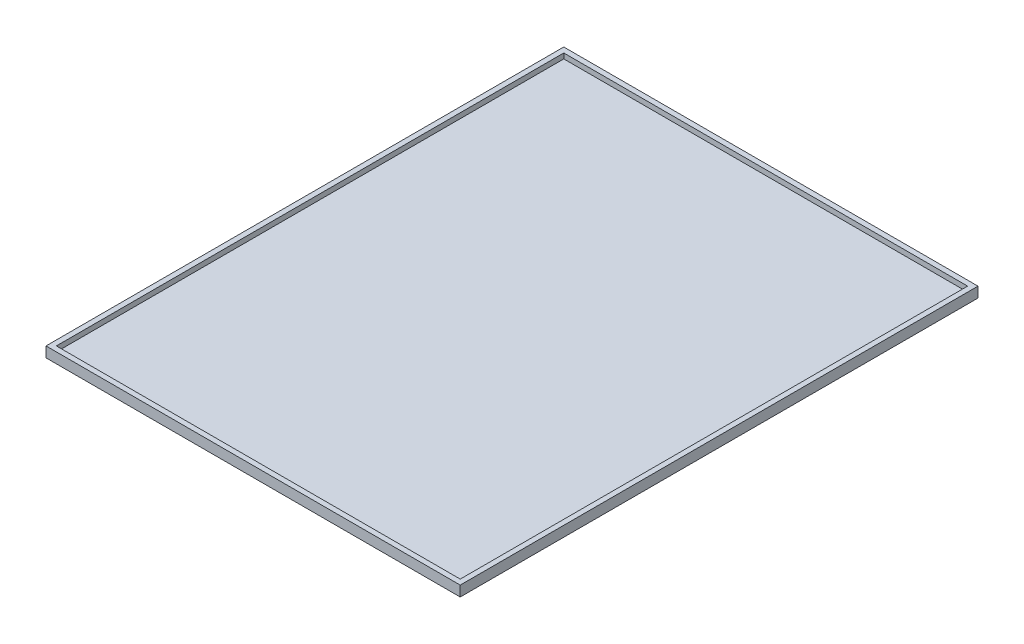
ISO-10303-21;
HEADER;
FILE_DESCRIPTION(('STEP AP214'),'2;1');
FILE_NAME('part.step','',(''),(''),'','','');
FILE_SCHEMA(('AUTOMOTIVE_DESIGN { 1 0 10303 214 1 1 1 1 }'));
ENDSEC;
DATA;
#1=APPLICATION_CONTEXT('core data for automotive mechanical design processes');
#2=APPLICATION_PROTOCOL_DEFINITION('international standard','automotive_design',2000,#1);
#3=PRODUCT_CONTEXT('',#1,'mechanical');
#4=PRODUCT('Part','Part','',(#3));
#5=PRODUCT_RELATED_PRODUCT_CATEGORY('part','',(#4));
#6=PRODUCT_DEFINITION_FORMATION('','',#4);
#7=PRODUCT_DEFINITION_CONTEXT('part definition',#1,'design');
#8=PRODUCT_DEFINITION('design','',#6,#7);
#9=PRODUCT_DEFINITION_SHAPE('','',#8);
#10=(LENGTH_UNIT() NAMED_UNIT(*) SI_UNIT(.MILLI.,.METRE.));
#11=(NAMED_UNIT(*) PLANE_ANGLE_UNIT() SI_UNIT($,.RADIAN.));
#12=(NAMED_UNIT(*) SI_UNIT($,.STERADIAN.) SOLID_ANGLE_UNIT());
#13=UNCERTAINTY_MEASURE_WITH_UNIT(LENGTH_MEASURE(1.E-05),#10,'distance_accuracy_value','');
#14=(GEOMETRIC_REPRESENTATION_CONTEXT(3) GLOBAL_UNCERTAINTY_ASSIGNED_CONTEXT((#13)) GLOBAL_UNIT_ASSIGNED_CONTEXT((#10,
#11,#12)) REPRESENTATION_CONTEXT('',''));
#15=CARTESIAN_POINT('',(0.,0.,0.));
#16=DIRECTION('',(0.,0.,1.));
#17=DIRECTION('',(1.,0.,0.));
#18=AXIS2_PLACEMENT_3D('',#15,#16,#17);
#19=CARTESIAN_POINT('',(0.,0.,-500.));
#20=DIRECTION('',(0.,-1.,0.));
#21=DIRECTION('',(0.,0.,-1.));
#22=AXIS2_PLACEMENT_3D('',#19,#20,#21);
#23=PLANE('',#22);
#24=DIRECTION('',(0.,0.,1.));
#25=VECTOR('',#24,1.);
#26=CARTESIAN_POINT('',(0.,0.,0.));
#27=LINE('',#26,#25);
#28=CARTESIAN_POINT('',(0.,0.,-500.));
#29=VERTEX_POINT('',#28);
#30=CARTESIAN_POINT('',(0.,0.,0.));
#31=VERTEX_POINT('',#30);
#32=EDGE_CURVE('E113',#29,#31,#27,.T.);
#33=ORIENTED_EDGE('',*,*,#32,.T.);
#34=DIRECTION('',(1.,0.,0.));
#35=VECTOR('',#34,1.);
#36=CARTESIAN_POINT('',(0.,0.,0.));
#37=LINE('',#36,#35);
#38=CARTESIAN_POINT('',(400.,0.,0.));
#39=VERTEX_POINT('',#38);
#40=EDGE_CURVE('E156',#31,#39,#37,.T.);
#41=ORIENTED_EDGE('',*,*,#40,.T.);
#42=DIRECTION('',(0.,0.,-1.));
#43=VECTOR('',#42,1.);
#44=CARTESIAN_POINT('',(400.,0.,0.));
#45=LINE('',#44,#43);
#46=CARTESIAN_POINT('',(400.,0.,-500.));
#47=VERTEX_POINT('',#46);
#48=EDGE_CURVE('E159',#39,#47,#45,.T.);
#49=ORIENTED_EDGE('',*,*,#48,.T.);
#50=DIRECTION('',(-1.,0.,0.));
#51=VECTOR('',#50,1.);
#52=CARTESIAN_POINT('',(0.,0.,-500.));
#53=LINE('',#52,#51);
#54=EDGE_CURVE('E147',#47,#29,#53,.T.);
#55=ORIENTED_EDGE('',*,*,#54,.T.);
#56=EDGE_LOOP('',(#33,#41,#49,#55));
#57=FACE_BOUND('',#56,.T.);
#58=DIRECTION('',(0.,0.,1.));
#59=VECTOR('',#58,1.);
#60=CARTESIAN_POINT('',(5.,0.,0.));
#61=LINE('',#60,#59);
#62=CARTESIAN_POINT('',(5.,0.,-495.));
#63=VERTEX_POINT('',#62);
#64=CARTESIAN_POINT('',(5.,0.,-5.));
#65=VERTEX_POINT('',#64);
#66=EDGE_CURVE('E137',#63,#65,#61,.T.);
#67=ORIENTED_EDGE('',*,*,#66,.F.);
#68=DIRECTION('',(-1.,0.,0.));
#69=VECTOR('',#68,1.);
#70=CARTESIAN_POINT('',(0.,0.,-495.));
#71=LINE('',#70,#69);
#72=CARTESIAN_POINT('',(395.,0.,-495.));
#73=VERTEX_POINT('',#72);
#74=EDGE_CURVE('E109',#73,#63,#71,.T.);
#75=ORIENTED_EDGE('',*,*,#74,.F.);
#76=DIRECTION('',(0.,0.,-1.));
#77=VECTOR('',#76,1.);
#78=CARTESIAN_POINT('',(395.,0.,0.));
#79=LINE('',#78,#77);
#80=CARTESIAN_POINT('',(395.,0.,-5.));
#81=VERTEX_POINT('',#80);
#82=EDGE_CURVE('E47',#81,#73,#79,.T.);
#83=ORIENTED_EDGE('',*,*,#82,.F.);
#84=DIRECTION('',(1.,0.,0.));
#85=VECTOR('',#84,1.);
#86=CARTESIAN_POINT('',(0.,0.,-5.));
#87=LINE('',#86,#85);
#88=EDGE_CURVE('E139',#65,#81,#87,.T.);
#89=ORIENTED_EDGE('',*,*,#88,.F.);
#90=EDGE_LOOP('',(#67,#75,#83,#89));
#91=FACE_BOUND('',#90,.T.);
#92=ADVANCED_FACE('F30',(#57,#91),#23,.F.);
#93=CARTESIAN_POINT('',(0.,-10.,0.));
#94=DIRECTION('',(-1.,0.,0.));
#95=DIRECTION('',(0.,0.,1.));
#96=AXIS2_PLACEMENT_3D('',#93,#94,#95);
#97=PLANE('',#96);
#98=ORIENTED_EDGE('',*,*,#32,.F.);
#99=DIRECTION('',(0.,1.,0.));
#100=VECTOR('',#99,1.);
#101=CARTESIAN_POINT('',(0.,-10.,-500.));
#102=LINE('',#101,#100);
#103=CARTESIAN_POINT('',(0.,-10.,-500.));
#104=VERTEX_POINT('',#103);
#105=EDGE_CURVE('E11',#104,#29,#102,.T.);
#106=ORIENTED_EDGE('',*,*,#105,.F.);
#107=DIRECTION('',(0.,0.,1.));
#108=VECTOR('',#107,1.);
#109=CARTESIAN_POINT('',(0.,-10.,0.));
#110=LINE('',#109,#108);
#111=CARTESIAN_POINT('',(0.,-10.,0.));
#112=VERTEX_POINT('',#111);
#113=EDGE_CURVE('E144',#104,#112,#110,.T.);
#114=ORIENTED_EDGE('',*,*,#113,.T.);
#115=DIRECTION('',(0.,1.,0.));
#116=VECTOR('',#115,1.);
#117=CARTESIAN_POINT('',(0.,-10.,0.));
#118=LINE('',#117,#116);
#119=EDGE_CURVE('E34',#112,#31,#118,.T.);
#120=ORIENTED_EDGE('',*,*,#119,.T.);
#121=EDGE_LOOP('',(#98,#106,#114,#120));
#122=FACE_BOUND('',#121,.T.);
#123=ADVANCED_FACE('F32',(#122),#97,.T.);
#124=CARTESIAN_POINT('',(0.,-10.,-500.));
#125=DIRECTION('',(0.,0.,-1.));
#126=DIRECTION('',(-1.,0.,0.));
#127=AXIS2_PLACEMENT_3D('',#124,#125,#126);
#128=PLANE('',#127);
#129=ORIENTED_EDGE('',*,*,#54,.F.);
#130=DIRECTION('',(0.,1.,0.));
#131=VECTOR('',#130,1.);
#132=CARTESIAN_POINT('',(400.,-10.,-500.));
#133=LINE('',#132,#131);
#134=CARTESIAN_POINT('',(400.,-10.,-500.));
#135=VERTEX_POINT('',#134);
#136=EDGE_CURVE('E39',#135,#47,#133,.T.);
#137=ORIENTED_EDGE('',*,*,#136,.F.);
#138=DIRECTION('',(-1.,0.,0.));
#139=VECTOR('',#138,1.);
#140=CARTESIAN_POINT('',(0.,-10.,-500.));
#141=LINE('',#140,#139);
#142=EDGE_CURVE('E152',#135,#104,#141,.T.);
#143=ORIENTED_EDGE('',*,*,#142,.T.);
#144=ORIENTED_EDGE('',*,*,#105,.T.);
#145=EDGE_LOOP('',(#129,#137,#143,#144));
#146=FACE_BOUND('',#145,.T.);
#147=ADVANCED_FACE('F169',(#146),#128,.T.);
#148=CARTESIAN_POINT('',(400.,-10.,0.));
#149=DIRECTION('',(1.,0.,0.));
#150=DIRECTION('',(0.,0.,-1.));
#151=AXIS2_PLACEMENT_3D('',#148,#149,#150);
#152=PLANE('',#151);
#153=ORIENTED_EDGE('',*,*,#48,.F.);
#154=DIRECTION('',(0.,1.,0.));
#155=VECTOR('',#154,1.);
#156=CARTESIAN_POINT('',(400.,-10.,0.));
#157=LINE('',#156,#155);
#158=CARTESIAN_POINT('',(400.,-10.,0.));
#159=VERTEX_POINT('',#158);
#160=EDGE_CURVE('E164',#159,#39,#157,.T.);
#161=ORIENTED_EDGE('',*,*,#160,.F.);
#162=DIRECTION('',(0.,0.,-1.));
#163=VECTOR('',#162,1.);
#164=CARTESIAN_POINT('',(400.,-10.,0.));
#165=LINE('',#164,#163);
#166=EDGE_CURVE('E149',#159,#135,#165,.T.);
#167=ORIENTED_EDGE('',*,*,#166,.T.);
#168=ORIENTED_EDGE('',*,*,#136,.T.);
#169=EDGE_LOOP('',(#153,#161,#167,#168));
#170=FACE_BOUND('',#169,.T.);
#171=ADVANCED_FACE('F173',(#170),#152,.T.);
#172=CARTESIAN_POINT('',(0.,-10.,0.));
#173=DIRECTION('',(0.,0.,1.));
#174=DIRECTION('',(1.,0.,0.));
#175=AXIS2_PLACEMENT_3D('',#172,#173,#174);
#176=PLANE('',#175);
#177=ORIENTED_EDGE('',*,*,#40,.F.);
#178=ORIENTED_EDGE('',*,*,#119,.F.);
#179=DIRECTION('',(1.,0.,0.));
#180=VECTOR('',#179,1.);
#181=CARTESIAN_POINT('',(0.,-10.,0.));
#182=LINE('',#181,#180);
#183=EDGE_CURVE('E146',#112,#159,#182,.T.);
#184=ORIENTED_EDGE('',*,*,#183,.T.);
#185=ORIENTED_EDGE('',*,*,#160,.T.);
#186=EDGE_LOOP('',(#177,#178,#184,#185));
#187=FACE_BOUND('',#186,.T.);
#188=ADVANCED_FACE('F166',(#187),#176,.T.);
#189=CARTESIAN_POINT('',(0.,-10.,-500.));
#190=DIRECTION('',(0.,-1.,0.));
#191=DIRECTION('',(0.,0.,-1.));
#192=AXIS2_PLACEMENT_3D('',#189,#190,#191);
#193=PLANE('',#192);
#194=ORIENTED_EDGE('',*,*,#113,.F.);
#195=ORIENTED_EDGE('',*,*,#142,.F.);
#196=ORIENTED_EDGE('',*,*,#166,.F.);
#197=ORIENTED_EDGE('',*,*,#183,.F.);
#198=EDGE_LOOP('',(#194,#195,#196,#197));
#199=FACE_BOUND('',#198,.T.);
#200=ADVANCED_FACE('F175',(#199),#193,.T.);
#201=CARTESIAN_POINT('',(5.,-10.,0.));
#202=DIRECTION('',(-1.,0.,0.));
#203=DIRECTION('',(0.,0.,1.));
#204=AXIS2_PLACEMENT_3D('',#201,#202,#203);
#205=PLANE('',#204);
#206=ORIENTED_EDGE('',*,*,#66,.T.);
#207=DIRECTION('',(0.,1.,0.));
#208=VECTOR('',#207,1.);
#209=CARTESIAN_POINT('',(5.,-10.,-5.));
#210=LINE('',#209,#208);
#211=CARTESIAN_POINT('',(5.,-5.,-5.));
#212=VERTEX_POINT('',#211);
#213=EDGE_CURVE('E119',#212,#65,#210,.T.);
#214=ORIENTED_EDGE('',*,*,#213,.F.);
#215=DIRECTION('',(0.,0.,1.));
#216=VECTOR('',#215,1.);
#217=CARTESIAN_POINT('',(5.,-5.,0.));
#218=LINE('',#217,#216);
#219=CARTESIAN_POINT('',(5.,-5.,-495.));
#220=VERTEX_POINT('',#219);
#221=EDGE_CURVE('E117',#220,#212,#218,.T.);
#222=ORIENTED_EDGE('',*,*,#221,.F.);
#223=DIRECTION('',(0.,1.,0.));
#224=VECTOR('',#223,1.);
#225=CARTESIAN_POINT('',(5.,-10.,-495.));
#226=LINE('',#225,#224);
#227=EDGE_CURVE('E103',#220,#63,#226,.T.);
#228=ORIENTED_EDGE('',*,*,#227,.T.);
#229=EDGE_LOOP('',(#206,#214,#222,#228));
#230=FACE_BOUND('',#229,.T.);
#231=ADVANCED_FACE('F118',(#230),#205,.F.);
#232=CARTESIAN_POINT('',(0.,-10.,-495.));
#233=DIRECTION('',(0.,0.,-1.));
#234=DIRECTION('',(-1.,0.,0.));
#235=AXIS2_PLACEMENT_3D('',#232,#233,#234);
#236=PLANE('',#235);
#237=ORIENTED_EDGE('',*,*,#74,.T.);
#238=ORIENTED_EDGE('',*,*,#227,.F.);
#239=DIRECTION('',(-1.,0.,0.));
#240=VECTOR('',#239,1.);
#241=CARTESIAN_POINT('',(0.,-5.,-495.));
#242=LINE('',#241,#240);
#243=CARTESIAN_POINT('',(395.,-5.,-495.));
#244=VERTEX_POINT('',#243);
#245=EDGE_CURVE('E107',#244,#220,#242,.T.);
#246=ORIENTED_EDGE('',*,*,#245,.F.);
#247=DIRECTION('',(0.,1.,0.));
#248=VECTOR('',#247,1.);
#249=CARTESIAN_POINT('',(395.,-10.,-495.));
#250=LINE('',#249,#248);
#251=EDGE_CURVE('E114',#244,#73,#250,.T.);
#252=ORIENTED_EDGE('',*,*,#251,.T.);
#253=EDGE_LOOP('',(#237,#238,#246,#252));
#254=FACE_BOUND('',#253,.T.);
#255=ADVANCED_FACE('F105',(#254),#236,.F.);
#256=CARTESIAN_POINT('',(395.,-10.,0.));
#257=DIRECTION('',(1.,0.,0.));
#258=DIRECTION('',(0.,0.,-1.));
#259=AXIS2_PLACEMENT_3D('',#256,#257,#258);
#260=PLANE('',#259);
#261=ORIENTED_EDGE('',*,*,#82,.T.);
#262=ORIENTED_EDGE('',*,*,#251,.F.);
#263=DIRECTION('',(0.,0.,-1.));
#264=VECTOR('',#263,1.);
#265=CARTESIAN_POINT('',(395.,-5.,0.));
#266=LINE('',#265,#264);
#267=CARTESIAN_POINT('',(395.,-5.,-5.));
#268=VERTEX_POINT('',#267);
#269=EDGE_CURVE('E128',#268,#244,#266,.T.);
#270=ORIENTED_EDGE('',*,*,#269,.F.);
#271=DIRECTION('',(0.,1.,0.));
#272=VECTOR('',#271,1.);
#273=CARTESIAN_POINT('',(395.,-10.,-5.));
#274=LINE('',#273,#272);
#275=EDGE_CURVE('E130',#268,#81,#274,.T.);
#276=ORIENTED_EDGE('',*,*,#275,.T.);
#277=EDGE_LOOP('',(#261,#262,#270,#276));
#278=FACE_BOUND('',#277,.T.);
#279=ADVANCED_FACE('F224',(#278),#260,.F.);
#280=CARTESIAN_POINT('',(0.,-10.,-5.));
#281=DIRECTION('',(0.,0.,1.));
#282=DIRECTION('',(1.,0.,0.));
#283=AXIS2_PLACEMENT_3D('',#280,#281,#282);
#284=PLANE('',#283);
#285=ORIENTED_EDGE('',*,*,#88,.T.);
#286=ORIENTED_EDGE('',*,*,#275,.F.);
#287=DIRECTION('',(1.,0.,0.));
#288=VECTOR('',#287,1.);
#289=CARTESIAN_POINT('',(0.,-5.,-5.));
#290=LINE('',#289,#288);
#291=EDGE_CURVE('E123',#212,#268,#290,.T.);
#292=ORIENTED_EDGE('',*,*,#291,.F.);
#293=ORIENTED_EDGE('',*,*,#213,.T.);
#294=EDGE_LOOP('',(#285,#286,#292,#293));
#295=FACE_BOUND('',#294,.T.);
#296=ADVANCED_FACE('F233',(#295),#284,.F.);
#297=CARTESIAN_POINT('',(0.,-5.,-500.));
#298=DIRECTION('',(0.,-1.,0.));
#299=DIRECTION('',(0.,0.,-1.));
#300=AXIS2_PLACEMENT_3D('',#297,#298,#299);
#301=PLANE('',#300);
#302=ORIENTED_EDGE('',*,*,#221,.T.);
#303=ORIENTED_EDGE('',*,*,#291,.T.);
#304=ORIENTED_EDGE('',*,*,#269,.T.);
#305=ORIENTED_EDGE('',*,*,#245,.T.);
#306=EDGE_LOOP('',(#302,#303,#304,#305));
#307=FACE_BOUND('',#306,.T.);
#308=ADVANCED_FACE('F126',(#307),#301,.F.);
#309=CLOSED_SHELL('',(#92,#123,#147,#171,#188,#200,#231,#255,#279,#296,#308));
#310=MANIFOLD_SOLID_BREP('B2',#309);
#311=ADVANCED_BREP_SHAPE_REPRESENTATION('',(#18,#310),#14);
#312=SHAPE_DEFINITION_REPRESENTATION(#9,#311);
ENDSEC;
END-ISO-10303-21;
